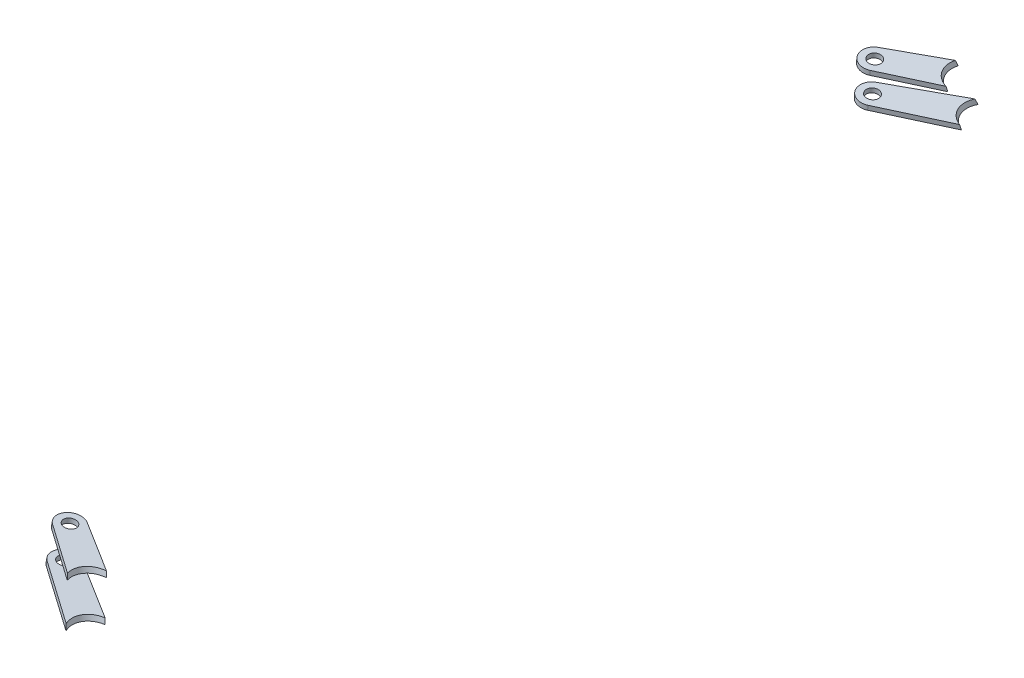
ISO-10303-21;
HEADER;
FILE_DESCRIPTION(('STEP AP214'),'2;1');
FILE_NAME('part.step','',(''),(''),'','','');
FILE_SCHEMA(('AUTOMOTIVE_DESIGN { 1 0 10303 214 1 1 1 1 }'));
ENDSEC;
DATA;
#1=APPLICATION_CONTEXT('core data for automotive mechanical design processes');
#2=APPLICATION_PROTOCOL_DEFINITION('international standard','automotive_design',2000,#1);
#3=PRODUCT_CONTEXT('',#1,'mechanical');
#4=PRODUCT('Part','Part','',(#3));
#5=PRODUCT_RELATED_PRODUCT_CATEGORY('part','',(#4));
#6=PRODUCT_DEFINITION_FORMATION('','',#4);
#7=PRODUCT_DEFINITION_CONTEXT('part definition',#1,'design');
#8=PRODUCT_DEFINITION('design','',#6,#7);
#9=PRODUCT_DEFINITION_SHAPE('','',#8);
#10=(LENGTH_UNIT() NAMED_UNIT(*) SI_UNIT(.MILLI.,.METRE.));
#11=(NAMED_UNIT(*) PLANE_ANGLE_UNIT() SI_UNIT($,.RADIAN.));
#12=(NAMED_UNIT(*) SI_UNIT($,.STERADIAN.) SOLID_ANGLE_UNIT());
#13=UNCERTAINTY_MEASURE_WITH_UNIT(LENGTH_MEASURE(1.E-05),#10,'distance_accuracy_value','');
#14=(GEOMETRIC_REPRESENTATION_CONTEXT(3) GLOBAL_UNCERTAINTY_ASSIGNED_CONTEXT((#13)) GLOBAL_UNIT_ASSIGNED_CONTEXT((#10,
#11,#12)) REPRESENTATION_CONTEXT('',''));
#15=CARTESIAN_POINT('',(0.,0.,0.));
#16=DIRECTION('',(0.,0.,1.));
#17=DIRECTION('',(1.,0.,0.));
#18=AXIS2_PLACEMENT_3D('',#15,#16,#17);
#19=CARTESIAN_POINT('',(-286.129302411596,180.27142449112,508.444930303704));
#20=DIRECTION('',(-0.501397384169984,0.100624420450439,0.859345907744088));
#21=DIRECTION('',(-0.846367762383379,0.149146955625286,-0.511289347068626));
#22=AXIS2_PLACEMENT_3D('',#19,#20,#21);
#23=PLANE('',#22);
#24=CARTESIAN_POINT('',(-639.298520510106,-11.032154332247,324.783951700712));
#25=DIRECTION('',(0.501397384169984,-0.100624420450439,-0.859345907744088));
#26=DIRECTION('',(-0.202674891665202,0.951920475194922,-0.229717864331821));
#27=AXIS2_PLACEMENT_3D('',#24,#25,#26);
#28=ELLIPSE('',#27,332.493914321312,12.7);
#29=CARTESIAN_POINT('',(-695.525150035273,215.977074424483,265.396274881335));
#30=VERTEX_POINT('',#29);
#31=CARTESIAN_POINT('',(-694.988595812932,212.923731464963,266.066863690908));
#32=VERTEX_POINT('',#31);
#33=EDGE_CURVE('E98',#30,#32,#28,.F.);
#34=ORIENTED_EDGE('',*,*,#33,.T.);
#35=DIRECTION('',(-0.85747457450148,0.0747850452358586,-0.509062423571586));
#36=VECTOR('',#35,1.);
#37=CARTESIAN_POINT('',(-286.475773413383,177.295094988669,508.591287871866));
#38=LINE('',#37,#36);
#39=CARTESIAN_POINT('',(-725.94940792128,215.623993143752,247.686160033562));
#40=VERTEX_POINT('',#39);
#41=EDGE_CURVE('E53',#32,#40,#38,.T.);
#42=ORIENTED_EDGE('',*,*,#41,.T.);
#43=DIRECTION('',(-0.115490333928878,-0.992109834150475,0.0487858560539045));
#44=VECTOR('',#43,1.);
#45=CARTESIAN_POINT('',(-725.602936919493,218.600322646203,247.539802465401));
#46=LINE('',#45,#44);
#47=CARTESIAN_POINT('',(-725.602936919493,218.600322646203,247.539802465401));
#48=VERTEX_POINT('',#47);
#49=EDGE_CURVE('E122',#48,#40,#46,.T.);
#50=ORIENTED_EDGE('',*,*,#49,.F.);
#51=DIRECTION('',(-0.85747457450148,0.0747850452358586,-0.509062423571586));
#52=VECTOR('',#51,1.);
#53=CARTESIAN_POINT('',(-286.129302411596,180.27142449112,508.444930303704));
#54=LINE('',#53,#52);
#55=EDGE_CURVE('E121',#30,#48,#54,.T.);
#56=ORIENTED_EDGE('',*,*,#55,.F.);
#57=EDGE_LOOP('',(#34,#42,#50,#56));
#58=FACE_BOUND('',#57,.T.);
#59=ADVANCED_FACE('F50',(#58),#23,.F.);
#60=CARTESIAN_POINT('',(-729.614115992853,219.405318009807,254.414569727353));
#61=DIRECTION('',(-0.115490333928878,-0.992109834150475,0.0487858560539045));
#62=DIRECTION('',(-0.993292586177464,0.115628016695291,0.));
#63=AXIS2_PLACEMENT_3D('',#60,#61,#62);
#64=CYLINDRICAL_SURFACE('',#63,7.99999999999999);
#65=CARTESIAN_POINT('',(-729.960586994639,216.428988507355,254.560927295515));
#66=DIRECTION('',(0.115490333928878,0.992109834150476,-0.0487858560539045));
#67=DIRECTION('',(0.993292586177464,-0.115628016695292,0.));
#68=AXIS2_PLACEMENT_3D('',#65,#66,#67);
#69=CIRCLE('',#68,7.99999999999999);
#70=CARTESIAN_POINT('',(-734.369252206518,217.267858948728,261.183613112626));
#71=VERTEX_POINT('',#70);
#72=EDGE_CURVE('E105',#40,#71,#69,.T.);
#73=ORIENTED_EDGE('',*,*,#72,.T.);
#74=DIRECTION('',(-0.115490333928878,-0.992109834150475,0.0487858560539045));
#75=VECTOR('',#74,1.);
#76=CARTESIAN_POINT('',(-734.022781204731,220.24418845118,261.037255544464));
#77=LINE('',#76,#75);
#78=CARTESIAN_POINT('',(-734.022781204731,220.24418845118,261.037255544464));
#79=VERTEX_POINT('',#78);
#80=EDGE_CURVE('E103',#79,#71,#77,.T.);
#81=ORIENTED_EDGE('',*,*,#80,.F.);
#82=CARTESIAN_POINT('',(-729.614115992853,219.405318009807,254.414569727353));
#83=DIRECTION('',(0.115490333928878,0.992109834150476,-0.0487858560539045));
#84=DIRECTION('',(0.993292586177464,-0.115628016695292,0.));
#85=AXIS2_PLACEMENT_3D('',#82,#83,#84);
#86=CIRCLE('',#85,7.99999999999999);
#87=EDGE_CURVE('E114',#48,#79,#86,.T.);
#88=ORIENTED_EDGE('',*,*,#87,.F.);
#89=ORIENTED_EDGE('',*,*,#49,.T.);
#90=EDGE_LOOP('',(#73,#81,#88,#89));
#91=FACE_BOUND('',#90,.T.);
#92=ADVANCED_FACE('F133',(#91),#64,.T.);
#93=CARTESIAN_POINT('',(-340.756964810652,187.541674565084,526.973243548694));
#94=DIRECTION('',(0.55108315148477,-0.104858805171619,-0.827835727138902));
#95=DIRECTION('',(0.81646334744491,-0.137115367811907,0.560880538251113));
#96=AXIS2_PLACEMENT_3D('',#93,#94,#95);
#97=PLANE('',#96);
#98=CARTESIAN_POINT('',(-727.593779343897,369.37508067401,246.427143695227));
#99=DIRECTION('',(-0.55108315148477,0.104858805171619,0.827835727138902));
#100=DIRECTION('',(-0.189249421914765,0.950516459117124,-0.246380026082417));
#101=AXIS2_PLACEMENT_3D('',#98,#99,#100);
#102=ELLIPSE('',#101,213.612425520889,12.7);
#103=CARTESIAN_POINT('',(-704.13175194097,214.753421560343,281.630952221903));
#104=VERTEX_POINT('',#103);
#105=CARTESIAN_POINT('',(-704.932216165397,217.825125904945,280.709008930689));
#106=VERTEX_POINT('',#105);
#107=EDGE_CURVE('E12',#104,#106,#102,.F.);
#108=ORIENTED_EDGE('',*,*,#107,.T.);
#109=DIRECTION('',(0.826419592530701,-0.0687219612634595,0.55884519244733));
#110=VECTOR('',#109,1.);
#111=CARTESIAN_POINT('',(-340.756964810652,187.541674565084,526.973243548694));
#112=LINE('',#111,#110);
#113=EDGE_CURVE('E111',#79,#106,#112,.T.);
#114=ORIENTED_EDGE('',*,*,#113,.F.);
#115=ORIENTED_EDGE('',*,*,#80,.T.);
#116=DIRECTION('',(0.826419592530701,-0.0687219612634595,0.55884519244733));
#117=VECTOR('',#116,1.);
#118=CARTESIAN_POINT('',(-341.103435812439,184.565345062633,527.119601116856));
#119=LINE('',#118,#117);
#120=EDGE_CURVE('E94',#71,#104,#119,.T.);
#121=ORIENTED_EDGE('',*,*,#120,.T.);
#122=EDGE_LOOP('',(#108,#114,#115,#121));
#123=FACE_BOUND('',#122,.T.);
#124=ADVANCED_FACE('F101',(#123),#97,.F.);
#125=CARTESIAN_POINT('',(-729.614115992853,219.405318009807,254.414569727353));
#126=DIRECTION('',(-0.115490333928878,-0.992109834150475,0.0487858560539045));
#127=DIRECTION('',(-0.993292586177464,0.115628016695291,0.));
#128=AXIS2_PLACEMENT_3D('',#125,#126,#127);
#129=CYLINDRICAL_SURFACE('',#128,4.00000000000005);
#130=CARTESIAN_POINT('',(-729.614115992853,219.405318009807,254.414569727353));
#131=DIRECTION('',(0.115490333928878,0.992109834150476,-0.0487858560539045));
#132=DIRECTION('',(0.993292586177464,-0.115628016695292,0.));
#133=AXIS2_PLACEMENT_3D('',#130,#131,#132);
#134=CIRCLE('',#133,4.00000000000005);
#135=CARTESIAN_POINT('',(-725.640945648143,218.942805943025,254.414569727353));
#136=VERTEX_POINT('',#135);
#137=EDGE_CURVE('E107',#136,#136,#134,.T.);
#138=ORIENTED_EDGE('',*,*,#137,.T.);
#139=EDGE_LOOP('',(#138));
#140=FACE_BOUND('',#139,.T.);
#141=CARTESIAN_POINT('',(-729.960586994639,216.428988507355,254.560927295515));
#142=DIRECTION('',(0.115490333928878,0.992109834150476,-0.0487858560539045));
#143=DIRECTION('',(0.993292586177464,-0.115628016695292,0.));
#144=AXIS2_PLACEMENT_3D('',#141,#142,#143);
#145=CIRCLE('',#144,4.00000000000005);
#146=CARTESIAN_POINT('',(-725.98741664993,215.966476440574,254.560927295515));
#147=VERTEX_POINT('',#146);
#148=EDGE_CURVE('E108',#147,#147,#145,.T.);
#149=ORIENTED_EDGE('',*,*,#148,.F.);
#150=EDGE_LOOP('',(#149));
#151=FACE_BOUND('',#150,.T.);
#152=ADVANCED_FACE('F141',(#140,#151),#129,.F.);
#153=CARTESIAN_POINT('',(13.9742106639152,120.044261303276,-5.90303800088192));
#154=DIRECTION('',(0.115490333928878,0.992109834150476,-0.0487858560539045));
#155=DIRECTION('',(0.993292586177464,-0.115628016695292,0.));
#156=AXIS2_PLACEMENT_3D('',#153,#154,#155);
#157=PLANE('',#156);
#158=ORIENTED_EDGE('',*,*,#55,.T.);
#159=ORIENTED_EDGE('',*,*,#87,.T.);
#160=ORIENTED_EDGE('',*,*,#113,.T.);
#161=CARTESIAN_POINT('',(-692.038418663605,216.189998884956,277.980418550402));
#162=DIRECTION('',(-0.115490333928878,-0.992109834150476,0.0487858560539045));
#163=DIRECTION('',(-0.90539408171368,0.0849400830971589,-0.415988868939171));
#164=AXIS2_PLACEMENT_3D('',#161,#162,#163);
#165=ELLIPSE('',#164,13.6334936945789,12.7);
#166=EDGE_CURVE('E68',#30,#106,#165,.F.);
#167=ORIENTED_EDGE('',*,*,#166,.F.);
#168=EDGE_LOOP('',(#158,#159,#160,#167));
#169=FACE_BOUND('',#168,.T.);
#170=ORIENTED_EDGE('',*,*,#137,.F.);
#171=EDGE_LOOP('',(#170));
#172=FACE_BOUND('',#171,.T.);
#173=ADVANCED_FACE('F112',(#169,#172),#157,.T.);
#174=CARTESIAN_POINT('',(13.6277396621286,117.067931800824,-5.75668043272021));
#175=DIRECTION('',(0.115490333928878,0.992109834150476,-0.0487858560539045));
#176=DIRECTION('',(0.993292586177464,-0.115628016695292,0.));
#177=AXIS2_PLACEMENT_3D('',#174,#175,#176);
#178=PLANE('',#177);
#179=CARTESIAN_POINT('',(-691.32450089441,213.11418838065,278.613978248979));
#180=DIRECTION('',(-0.115490333928878,-0.992109834150476,0.0487858560539045));
#181=DIRECTION('',(-0.90539408171368,0.0849400830971589,-0.415988868939171));
#182=AXIS2_PLACEMENT_3D('',#179,#180,#181);
#183=ELLIPSE('',#182,13.6334936945789,12.7);
#184=EDGE_CURVE('E59',#32,#104,#183,.F.);
#185=ORIENTED_EDGE('',*,*,#184,.T.);
#186=ORIENTED_EDGE('',*,*,#120,.F.);
#187=ORIENTED_EDGE('',*,*,#72,.F.);
#188=ORIENTED_EDGE('',*,*,#41,.F.);
#189=EDGE_LOOP('',(#185,#186,#187,#188));
#190=FACE_BOUND('',#189,.T.);
#191=ORIENTED_EDGE('',*,*,#148,.T.);
#192=EDGE_LOOP('',(#191));
#193=FACE_BOUND('',#192,.T.);
#194=ADVANCED_FACE('F92',(#190,#193),#178,.F.);
#195=CARTESIAN_POINT('',(-676.260714615963,148.214063927805,291.982195578494));
#196=DIRECTION('',(-0.221678460217085,0.955069289398282,-0.196726492176431));
#197=DIRECTION('',(-0.97410485020902,-0.226096750970159,0.));
#198=AXIS2_PLACEMENT_3D('',#195,#196,#197);
#199=CYLINDRICAL_SURFACE('',#198,12.7);
#200=ORIENTED_EDGE('',*,*,#33,.F.);
#201=ORIENTED_EDGE('',*,*,#166,.T.);
#202=ORIENTED_EDGE('',*,*,#107,.F.);
#203=ORIENTED_EDGE('',*,*,#184,.F.);
#204=EDGE_LOOP('',(#200,#201,#202,#203));
#205=FACE_BOUND('',#204,.T.);
#206=ADVANCED_FACE('F106',(#205),#199,.F.);
#207=CLOSED_SHELL('',(#59,#92,#124,#152,#173,#194,#206));
#208=MANIFOLD_SOLID_BREP('B2',#207);
#209=CARTESIAN_POINT('',(-732.385884007146,195.594681990195,255.585430272647));
#210=DIRECTION('',(0.115490333928878,0.992109834150475,-0.0487858560539045));
#211=DIRECTION('',(-0.993292586177463,0.115628016695291,0.));
#212=AXIS2_PLACEMENT_3D('',#209,#210,#211);
#213=CYLINDRICAL_SURFACE('',#212,4.00000000000005);
#214=CARTESIAN_POINT('',(-732.385884007146,195.594681990195,255.585430272647));
#215=DIRECTION('',(0.115490333928878,0.992109834150476,-0.0487858560539046));
#216=DIRECTION('',(0.993292586177463,-0.115628016695291,0.));
#217=AXIS2_PLACEMENT_3D('',#214,#215,#216);
#218=CIRCLE('',#217,4.00000000000005);
#219=CARTESIAN_POINT('',(-736.359054351856,196.057194056976,255.585430272647));
#220=VERTEX_POINT('',#219);
#221=EDGE_CURVE('E262',#220,#220,#218,.T.);
#222=CARTESIAN_POINT('',(-732.039413005359,198.571011492647,255.439072704485));
#223=DIRECTION('',(0.115490333928878,0.992109834150476,-0.0487858560539046));
#224=DIRECTION('',(0.993292586177463,-0.115628016695291,0.));
#225=AXIS2_PLACEMENT_3D('',#222,#223,#224);
#226=CIRCLE('',#225,4.00000000000005);
#227=CARTESIAN_POINT('',(-736.012583350069,199.033523559428,255.439072704485));
#228=VERTEX_POINT('',#227);
#229=EDGE_CURVE('E254',#228,#228,#226,.T.);
#230=CARTESIAN_POINT('',(-736.359054351856,196.057194056976,255.585430272647));
#231=CARTESIAN_POINT('',(-736.35544527892,196.088197489294,255.583905714645));
#232=CARTESIAN_POINT('',(-736.351836205985,196.119200921611,255.582381156643));
#233=CARTESIAN_POINT('',(-736.344618060114,196.181207786245,255.57933204064));
#234=CARTESIAN_POINT('',(-736.341008987179,196.212211218562,255.577807482638));
#235=CARTESIAN_POINT('',(-736.333790841309,196.274218083197,255.574758366635));
#236=CARTESIAN_POINT('',(-736.330181768373,196.305221515514,255.573233808633));
#237=CARTESIAN_POINT('',(-736.322963622503,196.367228380148,255.57018469263));
#238=CARTESIAN_POINT('',(-736.319354549568,196.398231812466,255.568660134628));
#239=CARTESIAN_POINT('',(-736.312136403697,196.4602386771,255.565611018625));
#240=CARTESIAN_POINT('',(-736.308527330762,196.491242109417,255.564086460623));
#241=CARTESIAN_POINT('',(-736.301309184891,196.553248974052,255.56103734462));
#242=CARTESIAN_POINT('',(-736.297700111956,196.584252406369,255.559512786618));
#243=CARTESIAN_POINT('',(-736.290481966085,196.646259271003,255.556463670615));
#244=CARTESIAN_POINT('',(-736.28687289315,196.67726270332,255.554939112613));
#245=CARTESIAN_POINT('',(-736.27965474728,196.739269567955,255.55188999661));
#246=CARTESIAN_POINT('',(-736.276045674344,196.770273000272,255.550365438608));
#247=CARTESIAN_POINT('',(-736.268827528474,196.832279864906,255.547316322605));
#248=CARTESIAN_POINT('',(-736.265218455539,196.863283297224,255.545791764603));
#249=CARTESIAN_POINT('',(-736.258000309668,196.925290161858,255.5427426486));
#250=CARTESIAN_POINT('',(-736.254391236733,196.956293594175,255.541218090598));
#251=CARTESIAN_POINT('',(-736.247173090862,197.01830045881,255.538168974595));
#252=CARTESIAN_POINT('',(-736.243564017927,197.049303891127,255.536644416593));
#253=CARTESIAN_POINT('',(-736.236345872056,197.111310755761,255.53359530059));
#254=CARTESIAN_POINT('',(-736.232736799121,197.142314188078,255.532070742588));
#255=CARTESIAN_POINT('',(-736.22551865325,197.204321052713,255.529021626585));
#256=CARTESIAN_POINT('',(-736.221909580315,197.23532448503,255.527497068583));
#257=CARTESIAN_POINT('',(-736.214691434444,197.297331349665,255.524447952579));
#258=CARTESIAN_POINT('',(-736.211082361509,197.328334781982,255.522923394578));
#259=CARTESIAN_POINT('',(-736.203864215639,197.390341646616,255.519874278574));
#260=CARTESIAN_POINT('',(-736.200255142703,197.421345078933,255.518349720573));
#261=CARTESIAN_POINT('',(-736.193036996833,197.483351943568,255.515300604569));
#262=CARTESIAN_POINT('',(-736.189427923898,197.514355375885,255.513776046568));
#263=CARTESIAN_POINT('',(-736.182209778027,197.576362240519,255.510726930564));
#264=CARTESIAN_POINT('',(-736.178600705092,197.607365672837,255.509202372563));
#265=CARTESIAN_POINT('',(-736.171382559221,197.669372537471,255.506153256559));
#266=CARTESIAN_POINT('',(-736.167773486286,197.700375969788,255.504628698558));
#267=CARTESIAN_POINT('',(-736.160555340415,197.762382834423,255.501579582554));
#268=CARTESIAN_POINT('',(-736.15694626748,197.79338626674,255.500055024553));
#269=CARTESIAN_POINT('',(-736.14972812161,197.855393131374,255.497005908549));
#270=CARTESIAN_POINT('',(-736.146119048674,197.886396563691,255.495481350547));
#271=CARTESIAN_POINT('',(-736.138900902804,197.948403428326,255.492432234544));
#272=CARTESIAN_POINT('',(-736.135291829868,197.979406860643,255.490907676542));
#273=CARTESIAN_POINT('',(-736.128073683998,198.041413725277,255.487858560539));
#274=CARTESIAN_POINT('',(-736.124464611063,198.072417157595,255.486334002537));
#275=CARTESIAN_POINT('',(-736.117246465192,198.134424022229,255.483284886534));
#276=CARTESIAN_POINT('',(-736.113637392257,198.165427454546,255.481760328532));
#277=CARTESIAN_POINT('',(-736.106419246386,198.227434319181,255.478711212529));
#278=CARTESIAN_POINT('',(-736.102810173451,198.258437751498,255.477186654527));
#279=CARTESIAN_POINT('',(-736.09559202758,198.320444616132,255.474137538524));
#280=CARTESIAN_POINT('',(-736.091982954645,198.351448048449,255.472612980522));
#281=CARTESIAN_POINT('',(-736.084764808775,198.413454913084,255.469563864519));
#282=CARTESIAN_POINT('',(-736.081155735839,198.444458345401,255.468039306517));
#283=CARTESIAN_POINT('',(-736.073937589969,198.506465210035,255.464990190514));
#284=CARTESIAN_POINT('',(-736.070328517033,198.537468642353,255.463465632512));
#285=CARTESIAN_POINT('',(-736.063110371163,198.599475506987,255.460416516509));
#286=CARTESIAN_POINT('',(-736.059501298228,198.630478939304,255.458891958507));
#287=CARTESIAN_POINT('',(-736.052283152357,198.692485803939,255.455842842504));
#288=CARTESIAN_POINT('',(-736.048674079422,198.723489236256,255.454318284502));
#289=CARTESIAN_POINT('',(-736.041455933551,198.78549610089,255.451269168499));
#290=CARTESIAN_POINT('',(-736.037846860616,198.816499533207,255.449744610497));
#291=CARTESIAN_POINT('',(-736.030628714745,198.878506397842,255.446695494494));
#292=CARTESIAN_POINT('',(-736.02701964181,198.909509830159,255.445170936492));
#293=CARTESIAN_POINT('',(-736.01980149594,198.971516694793,255.442121820489));
#294=CARTESIAN_POINT('',(-736.016192423004,199.002520127111,255.440597262487));
#295=CARTESIAN_POINT('',(-736.012583350069,199.033523559428,255.439072704485));
#296=B_SPLINE_CURVE_WITH_KNOTS('',3,(#230,#231,#232,#233,#234,#235,#236,#237,#238,#239,#240,
#241,#242,#243,#244,#245,#246,#247,#248,#249,#250,#251,#252,#253,#254,#255,#256,#257,#258,#259,
#260,#261,#262,#263,#264,#265,#266,#267,#268,#269,#270,#271,#272,#273,#274,#275,#276,#277,#278,
#279,#280,#281,#282,#283,#284,#285,#286,#287,#288,#289,#290,#291,#292,#293,#294,#295),
.UNSPECIFIED.,.F.,.F.,(4,2,2,2,2,2,2,2,2,2,2,2,2,2,2,2,2,2,2,2,2,2,2,2,2,2,2,2,2,2,2,2,4),(0.,
0.0937500000000034,0.187500000000032,0.281249999999992,0.375000000000023,0.468750000000024,
0.562500000000027,0.65625,0.750000000000018,0.843750000000019,0.937500000000023,
1.03125000000002,1.12500000000003,1.21875000000003,1.31250000000002,1.40625000000002,
1.50000000000002,1.59375000000002,1.68750000000003,1.78125000000001,1.87500000000002,
1.96874999999999,2.06250000000002,2.15625000000002,2.25000000000001,2.34374999999999,
2.43750000000002,2.53124999999999,2.62500000000002,2.71874999999999,2.81250000000001,
2.90624999999999,3.00000000000002),.UNSPECIFIED.);
#297=EDGE_CURVE('BSEAM213',#220,#228,#296,.T.);
#298=ORIENTED_EDGE('',*,*,#221,.F.);
#299=ORIENTED_EDGE('',*,*,#229,.T.);
#300=ORIENTED_EDGE('',*,*,#297,.T.);
#301=ORIENTED_EDGE('',*,*,#297,.F.);
#302=EDGE_LOOP('',(#298,#300,#299,#301));
#303=FACE_BOUND('',#302,.T.);
#304=ADVANCED_FACE('F213',(#303),#213,.F.);
#305=CARTESIAN_POINT('',(-732.385884007146,195.594681990195,255.585430272647));
#306=DIRECTION('',(0.115490333928878,0.992109834150475,-0.0487858560539045));
#307=DIRECTION('',(-0.993292586177463,0.115628016695291,0.));
#308=AXIS2_PLACEMENT_3D('',#305,#306,#307);
#309=CYLINDRICAL_SURFACE('',#308,7.99999999999999);
#310=CARTESIAN_POINT('',(-732.039413005359,198.571011492647,255.439072704485));
#311=DIRECTION('',(0.115490333928878,0.992109834150476,-0.0487858560539046));
#312=DIRECTION('',(0.993292586177463,-0.115628016695291,0.));
#313=AXIS2_PLACEMENT_3D('',#310,#311,#312);
#314=CIRCLE('',#313,7.99999999999999);
#315=CARTESIAN_POINT('',(-728.028233931999,197.766016129043,248.564305442533));
#316=VERTEX_POINT('',#315);
#317=CARTESIAN_POINT('',(-736.448078217237,199.40988193402,262.061758521596));
#318=VERTEX_POINT('',#317);
#319=EDGE_CURVE('E255',#316,#318,#314,.T.);
#320=ORIENTED_EDGE('',*,*,#319,.F.);
#321=DIRECTION('',(0.115490333928878,0.992109834150475,-0.0487858560539045));
#322=VECTOR('',#321,1.);
#323=CARTESIAN_POINT('',(-728.374704933786,194.789686626592,248.710663010694));
#324=LINE('',#323,#322);
#325=CARTESIAN_POINT('',(-728.374704933786,194.789686626592,248.710663010694));
#326=VERTEX_POINT('',#325);
#327=EDGE_CURVE('E221',#326,#316,#324,.T.);
#328=ORIENTED_EDGE('',*,*,#327,.F.);
#329=CARTESIAN_POINT('',(-732.385884007146,195.594681990195,255.585430272647));
#330=DIRECTION('',(0.115490333928878,0.992109834150476,-0.0487858560539046));
#331=DIRECTION('',(0.993292586177463,-0.115628016695291,0.));
#332=AXIS2_PLACEMENT_3D('',#329,#330,#331);
#333=CIRCLE('',#332,7.99999999999999);
#334=CARTESIAN_POINT('',(-736.794549219024,196.433552431568,262.208116089758));
#335=VERTEX_POINT('',#334);
#336=EDGE_CURVE('E261',#326,#335,#333,.T.);
#337=ORIENTED_EDGE('',*,*,#336,.T.);
#338=DIRECTION('',(0.115490333928878,0.992109834150475,-0.0487858560539045));
#339=VECTOR('',#338,1.);
#340=CARTESIAN_POINT('',(-736.794549219024,196.433552431568,262.208116089758));
#341=LINE('',#340,#339);
#342=EDGE_CURVE('E249',#335,#318,#341,.T.);
#343=ORIENTED_EDGE('',*,*,#342,.T.);
#344=EDGE_LOOP('',(#320,#328,#337,#343));
#345=FACE_BOUND('',#344,.T.);
#346=ADVANCED_FACE('F259',(#345),#309,.T.);
#347=CARTESIAN_POINT('',(11.5489136514089,99.2099547861161,-4.87853502374995));
#348=DIRECTION('',(-0.115490333928878,-0.992109834150476,0.0487858560539046));
#349=DIRECTION('',(0.993292586177463,-0.115628016695291,0.));
#350=AXIS2_PLACEMENT_3D('',#347,#348,#349);
#351=PLANE('',#350);
#352=CARTESIAN_POINT('',(-687.040994279238,194.659325354811,282.415336440443));
#353=DIRECTION('',(0.115490333928878,0.992109834150476,-0.0487858560539046));
#354=DIRECTION('',(-0.90539408171368,0.0849400830971584,-0.415988868939171));
#355=AXIS2_PLACEMENT_3D('',#352,#353,#354);
#356=ELLIPSE('',#355,13.6334936945789,12.7);
#357=CARTESIAN_POINT('',(-699.092698006537,196.303548280965,287.322382581663));
#358=VERTEX_POINT('',#357);
#359=CARTESIAN_POINT('',(-691.708685251136,194.598389738927,270.126364568607));
#360=VERTEX_POINT('',#359);
#361=EDGE_CURVE('E48',#358,#360,#356,.F.);
#362=ORIENTED_EDGE('',*,*,#361,.T.);
#363=DIRECTION('',(-0.85747457450148,0.0747850452358581,-0.509062423571586));
#364=VECTOR('',#363,1.);
#365=CARTESIAN_POINT('',(-288.554599424102,159.437117973961,509.469433280836));
#366=LINE('',#365,#364);
#367=EDGE_CURVE('E267',#360,#316,#366,.T.);
#368=ORIENTED_EDGE('',*,*,#367,.T.);
#369=ORIENTED_EDGE('',*,*,#319,.T.);
#370=DIRECTION('',(0.826419592530701,-0.0687219612634589,0.55884519244733));
#371=VECTOR('',#370,1.);
#372=CARTESIAN_POINT('',(-343.182261823159,166.707368047924,527.997746525826));
#373=LINE('',#372,#371);
#374=EDGE_CURVE('E246',#318,#358,#373,.T.);
#375=ORIENTED_EDGE('',*,*,#374,.T.);
#376=EDGE_LOOP('',(#362,#368,#369,#375));
#377=FACE_BOUND('',#376,.T.);
#378=ORIENTED_EDGE('',*,*,#229,.F.);
#379=EDGE_LOOP('',(#378));
#380=FACE_BOUND('',#379,.T.);
#381=ADVANCED_FACE('F264',(#377,#380),#351,.F.);
#382=CARTESIAN_POINT('',(11.2024426496222,96.2336252836647,-4.73217745558823));
#383=DIRECTION('',(-0.115490333928878,-0.992109834150476,0.0487858560539046));
#384=DIRECTION('',(0.993292586177463,-0.115628016695291,0.));
#385=AXIS2_PLACEMENT_3D('',#382,#383,#384);
#386=PLANE('',#385);
#387=DIRECTION('',(0.826419592530701,-0.0687219612634589,0.55884519244733));
#388=VECTOR('',#387,1.);
#389=CARTESIAN_POINT('',(-343.528732824945,163.731038545473,528.144104093988));
#390=LINE('',#389,#388);
#391=CARTESIAN_POINT('',(-698.200136810533,193.224185496788,288.306604103295));
#392=VERTEX_POINT('',#391);
#393=EDGE_CURVE('E236',#335,#392,#390,.T.);
#394=ORIENTED_EDGE('',*,*,#393,.F.);
#395=ORIENTED_EDGE('',*,*,#336,.F.);
#396=DIRECTION('',(-0.85747457450148,0.0747850452358581,-0.509062423571586));
#397=VECTOR('',#396,1.);
#398=CARTESIAN_POINT('',(-288.901070425889,156.460788471509,509.615790848998));
#399=LINE('',#398,#397);
#400=CARTESIAN_POINT('',(-691.152868761745,191.543366811796,270.808388931652));
#401=VERTEX_POINT('',#400);
#402=EDGE_CURVE('E275',#401,#326,#399,.T.);
#403=ORIENTED_EDGE('',*,*,#402,.F.);
#404=CARTESIAN_POINT('',(-686.327076510043,191.583514850505,283.04889613902));
#405=DIRECTION('',(0.115490333928878,0.992109834150476,-0.0487858560539046));
#406=DIRECTION('',(-0.90539408171368,0.0849400830971584,-0.415988868939171));
#407=AXIS2_PLACEMENT_3D('',#404,#405,#406);
#408=ELLIPSE('',#407,13.6334936945789,12.7);
#409=EDGE_CURVE('E270',#392,#401,#408,.F.);
#410=ORIENTED_EDGE('',*,*,#409,.F.);
#411=EDGE_LOOP('',(#394,#395,#403,#410));
#412=FACE_BOUND('',#411,.T.);
#413=ORIENTED_EDGE('',*,*,#221,.T.);
#414=EDGE_LOOP('',(#413));
#415=FACE_BOUND('',#414,.T.);
#416=ADVANCED_FACE('F284',(#412,#415),#386,.T.);
#417=CARTESIAN_POINT('',(-343.528732824945,163.731038545473,528.144104093988));
#418=DIRECTION('',(0.55108315148477,-0.104858805171619,-0.827835727138902));
#419=DIRECTION('',(0.832424785453371,0.,0.554138048290233));
#420=AXIS2_PLACEMENT_3D('',#417,#418,#419);
#421=PLANE('',#420);
#422=CARTESIAN_POINT('',(-727.593779343897,369.375080674011,246.427143695227));
#423=DIRECTION('',(-0.55108315148477,0.104858805171619,0.827835727138902));
#424=DIRECTION('',(-0.189249421914765,0.950516459117124,-0.246380026082417));
#425=AXIS2_PLACEMENT_3D('',#422,#423,#424);
#426=ELLIPSE('',#425,213.612425520889,12.7);
#427=EDGE_CURVE('E228',#392,#358,#426,.F.);
#428=ORIENTED_EDGE('',*,*,#427,.T.);
#429=ORIENTED_EDGE('',*,*,#374,.F.);
#430=ORIENTED_EDGE('',*,*,#342,.F.);
#431=ORIENTED_EDGE('',*,*,#393,.T.);
#432=EDGE_LOOP('',(#428,#429,#430,#431));
#433=FACE_BOUND('',#432,.T.);
#434=ADVANCED_FACE('F248',(#433),#421,.F.);
#435=CARTESIAN_POINT('',(-288.901070425889,156.460788471509,509.615790848998));
#436=DIRECTION('',(-0.501397384169984,0.100624420450439,0.859345907744088));
#437=DIRECTION('',(-0.863729783317673,0.,-0.503955217663242));
#438=AXIS2_PLACEMENT_3D('',#435,#436,#437);
#439=PLANE('',#438);
#440=CARTESIAN_POINT('',(-639.298520510106,-11.0321543322471,324.783951700712));
#441=DIRECTION('',(0.501397384169984,-0.100624420450439,-0.859345907744088));
#442=DIRECTION('',(-0.202674891665202,0.951920475194922,-0.229717864331821));
#443=AXIS2_PLACEMENT_3D('',#440,#441,#442);
#444=ELLIPSE('',#443,332.493914321312,12.7);
#445=EDGE_CURVE('E281',#360,#401,#444,.F.);
#446=ORIENTED_EDGE('',*,*,#445,.T.);
#447=ORIENTED_EDGE('',*,*,#402,.T.);
#448=ORIENTED_EDGE('',*,*,#327,.T.);
#449=ORIENTED_EDGE('',*,*,#367,.F.);
#450=EDGE_LOOP('',(#446,#447,#448,#449));
#451=FACE_BOUND('',#450,.T.);
#452=ADVANCED_FACE('F215',(#451),#439,.F.);
#453=CARTESIAN_POINT('',(-676.260714615963,148.214063927805,291.982195578494));
#454=DIRECTION('',(-0.221678460217085,0.955069289398282,-0.196726492176431));
#455=DIRECTION('',(-0.97410485020902,-0.226096750970159,0.));
#456=AXIS2_PLACEMENT_3D('',#453,#454,#455);
#457=CYLINDRICAL_SURFACE('',#456,12.7);
#458=ORIENTED_EDGE('',*,*,#427,.F.);
#459=ORIENTED_EDGE('',*,*,#409,.T.);
#460=ORIENTED_EDGE('',*,*,#445,.F.);
#461=ORIENTED_EDGE('',*,*,#361,.F.);
#462=EDGE_LOOP('',(#458,#459,#460,#461));
#463=FACE_BOUND('',#462,.T.);
#464=ADVANCED_FACE('F309',(#463),#457,.F.);
#465=CLOSED_SHELL('',(#304,#346,#381,#416,#434,#452,#464));
#466=MANIFOLD_SOLID_BREP('B6',#465);
#467=CARTESIAN_POINT('',(-286.129302411596,180.27142449112,-508.444930303704));
#468=DIRECTION('',(-0.501397384169984,0.100624420450439,-0.859345907744088));
#469=DIRECTION('',(-0.846367762383379,0.149146955625286,0.511289347068626));
#470=AXIS2_PLACEMENT_3D('',#467,#468,#469);
#471=PLANE('',#470);
#472=CARTESIAN_POINT('',(-639.298520510106,-11.032154332247,-324.783951700712));
#473=DIRECTION('',(-0.501397384169984,0.100624420450439,-0.859345907744088));
#474=DIRECTION('',(-0.202674891665202,0.951920475194922,0.229717864331821));
#475=AXIS2_PLACEMENT_3D('',#472,#473,#474);
#476=ELLIPSE('',#475,332.493914321312,12.7);
#477=CARTESIAN_POINT('',(-695.525150035273,215.977074424483,-265.396274881335));
#478=VERTEX_POINT('',#477);
#479=CARTESIAN_POINT('',(-694.988595812932,212.923731464963,-266.066863690908));
#480=VERTEX_POINT('',#479);
#481=EDGE_CURVE('E409',#478,#480,#476,.F.);
#482=ORIENTED_EDGE('',*,*,#481,.F.);
#483=DIRECTION('',(-0.85747457450148,0.0747850452358586,0.509062423571586));
#484=VECTOR('',#483,1.);
#485=CARTESIAN_POINT('',(-286.129302411596,180.27142449112,-508.444930303704));
#486=LINE('',#485,#484);
#487=CARTESIAN_POINT('',(-725.602936919493,218.600322646203,-247.539802465401));
#488=VERTEX_POINT('',#487);
#489=EDGE_CURVE('E432',#478,#488,#486,.T.);
#490=ORIENTED_EDGE('',*,*,#489,.T.);
#491=DIRECTION('',(-0.115490333928878,-0.992109834150475,-0.0487858560539045));
#492=VECTOR('',#491,1.);
#493=CARTESIAN_POINT('',(-725.602936919493,218.600322646203,-247.539802465401));
#494=LINE('',#493,#492);
#495=CARTESIAN_POINT('',(-725.94940792128,215.623993143752,-247.686160033562));
#496=VERTEX_POINT('',#495);
#497=EDGE_CURVE('E434',#488,#496,#494,.T.);
#498=ORIENTED_EDGE('',*,*,#497,.T.);
#499=DIRECTION('',(-0.85747457450148,0.0747850452358586,0.509062423571586));
#500=VECTOR('',#499,1.);
#501=CARTESIAN_POINT('',(-286.475773413383,177.295094988669,-508.591287871866));
#502=LINE('',#501,#500);
#503=EDGE_CURVE('E378',#480,#496,#502,.T.);
#504=ORIENTED_EDGE('',*,*,#503,.F.);
#505=EDGE_LOOP('',(#482,#490,#498,#504));
#506=FACE_BOUND('',#505,.T.);
#507=ADVANCED_FACE('F375',(#506),#471,.F.);
#508=CARTESIAN_POINT('',(-729.614115992853,219.405318009807,-254.414569727353));
#509=DIRECTION('',(-0.115490333928878,-0.992109834150475,-0.0487858560539045));
#510=DIRECTION('',(-0.993292586177464,0.115628016695291,0.));
#511=AXIS2_PLACEMENT_3D('',#508,#509,#510);
#512=CYLINDRICAL_SURFACE('',#511,7.99999999999999);
#513=CARTESIAN_POINT('',(-729.960586994639,216.428988507355,-254.560927295515));
#514=DIRECTION('',(-0.115490333928878,-0.992109834150476,-0.0487858560539045));
#515=DIRECTION('',(0.993292586177464,-0.115628016695292,0.));
#516=AXIS2_PLACEMENT_3D('',#513,#514,#515);
#517=CIRCLE('',#516,7.99999999999999);
#518=CARTESIAN_POINT('',(-734.369252206518,217.267858948728,-261.183613112626));
#519=VERTEX_POINT('',#518);
#520=EDGE_CURVE('E428',#496,#519,#517,.T.);
#521=ORIENTED_EDGE('',*,*,#520,.F.);
#522=ORIENTED_EDGE('',*,*,#497,.F.);
#523=CARTESIAN_POINT('',(-729.614115992853,219.405318009807,-254.414569727353));
#524=DIRECTION('',(-0.115490333928878,-0.992109834150476,-0.0487858560539045));
#525=DIRECTION('',(0.993292586177464,-0.115628016695292,0.));
#526=AXIS2_PLACEMENT_3D('',#523,#524,#525);
#527=CIRCLE('',#526,7.99999999999999);
#528=CARTESIAN_POINT('',(-734.022781204731,220.24418845118,-261.037255544464));
#529=VERTEX_POINT('',#528);
#530=EDGE_CURVE('E440',#488,#529,#527,.T.);
#531=ORIENTED_EDGE('',*,*,#530,.T.);
#532=DIRECTION('',(-0.115490333928878,-0.992109834150475,-0.0487858560539045));
#533=VECTOR('',#532,1.);
#534=CARTESIAN_POINT('',(-734.022781204731,220.24418845118,-261.037255544464));
#535=LINE('',#534,#533);
#536=EDGE_CURVE('E436',#529,#519,#535,.T.);
#537=ORIENTED_EDGE('',*,*,#536,.T.);
#538=EDGE_LOOP('',(#521,#522,#531,#537));
#539=FACE_BOUND('',#538,.T.);
#540=ADVANCED_FACE('F454',(#539),#512,.T.);
#541=CARTESIAN_POINT('',(-340.756964810652,187.541674565084,-526.973243548694));
#542=DIRECTION('',(0.55108315148477,-0.104858805171619,0.827835727138902));
#543=DIRECTION('',(0.81646334744491,-0.137115367811907,-0.560880538251113));
#544=AXIS2_PLACEMENT_3D('',#541,#542,#543);
#545=PLANE('',#544);
#546=CARTESIAN_POINT('',(-727.593779343897,369.37508067401,-246.427143695227));
#547=DIRECTION('',(0.55108315148477,-0.104858805171619,0.827835727138902));
#548=DIRECTION('',(-0.189249421914765,0.950516459117124,0.246380026082417));
#549=AXIS2_PLACEMENT_3D('',#546,#547,#548);
#550=ELLIPSE('',#549,213.612425520889,12.7);
#551=CARTESIAN_POINT('',(-704.13175194097,214.753421560343,-281.630952221903));
#552=VERTEX_POINT('',#551);
#553=CARTESIAN_POINT('',(-704.932216165397,217.825125904945,-280.709008930689));
#554=VERTEX_POINT('',#553);
#555=EDGE_CURVE('E211',#552,#554,#550,.F.);
#556=ORIENTED_EDGE('',*,*,#555,.F.);
#557=DIRECTION('',(0.826419592530701,-0.0687219612634595,-0.55884519244733));
#558=VECTOR('',#557,1.);
#559=CARTESIAN_POINT('',(-341.103435812439,184.565345062633,-527.119601116856));
#560=LINE('',#559,#558);
#561=EDGE_CURVE('E421',#519,#552,#560,.T.);
#562=ORIENTED_EDGE('',*,*,#561,.F.);
#563=ORIENTED_EDGE('',*,*,#536,.F.);
#564=DIRECTION('',(0.826419592530701,-0.0687219612634595,-0.55884519244733));
#565=VECTOR('',#564,1.);
#566=CARTESIAN_POINT('',(-340.756964810652,187.541674565084,-526.973243548694));
#567=LINE('',#566,#565);
#568=EDGE_CURVE('E423',#529,#554,#567,.T.);
#569=ORIENTED_EDGE('',*,*,#568,.T.);
#570=EDGE_LOOP('',(#556,#562,#563,#569));
#571=FACE_BOUND('',#570,.T.);
#572=ADVANCED_FACE('F419',(#571),#545,.F.);
#573=CARTESIAN_POINT('',(-729.614115992853,219.405318009807,-254.414569727353));
#574=DIRECTION('',(-0.115490333928878,-0.992109834150475,-0.0487858560539045));
#575=DIRECTION('',(-0.993292586177464,0.115628016695291,0.));
#576=AXIS2_PLACEMENT_3D('',#573,#574,#575);
#577=CYLINDRICAL_SURFACE('',#576,4.00000000000005);
#578=CARTESIAN_POINT('',(-729.614115992853,219.405318009807,-254.414569727353));
#579=DIRECTION('',(-0.115490333928878,-0.992109834150476,-0.0487858560539045));
#580=DIRECTION('',(0.993292586177464,-0.115628016695292,0.));
#581=AXIS2_PLACEMENT_3D('',#578,#579,#580);
#582=CIRCLE('',#581,4.00000000000005);
#583=CARTESIAN_POINT('',(-725.640945648143,218.942805943025,-254.414569727353));
#584=VERTEX_POINT('',#583);
#585=EDGE_CURVE('E439',#584,#584,#582,.T.);
#586=ORIENTED_EDGE('',*,*,#585,.F.);
#587=EDGE_LOOP('',(#586));
#588=FACE_BOUND('',#587,.T.);
#589=CARTESIAN_POINT('',(-729.960586994639,216.428988507355,-254.560927295515));
#590=DIRECTION('',(-0.115490333928878,-0.992109834150476,-0.0487858560539045));
#591=DIRECTION('',(0.993292586177464,-0.115628016695292,0.));
#592=AXIS2_PLACEMENT_3D('',#589,#590,#591);
#593=CIRCLE('',#592,4.00000000000005);
#594=CARTESIAN_POINT('',(-725.98741664993,215.966476440574,-254.560927295515));
#595=VERTEX_POINT('',#594);
#596=EDGE_CURVE('E435',#595,#595,#593,.T.);
#597=ORIENTED_EDGE('',*,*,#596,.T.);
#598=EDGE_LOOP('',(#597));
#599=FACE_BOUND('',#598,.T.);
#600=ADVANCED_FACE('F459',(#588,#599),#577,.F.);
#601=CARTESIAN_POINT('',(13.9742106639152,120.044261303276,5.90303800088192));
#602=DIRECTION('',(0.115490333928878,0.992109834150476,0.0487858560539045));
#603=DIRECTION('',(0.993292586177464,-0.115628016695292,0.));
#604=AXIS2_PLACEMENT_3D('',#601,#602,#603);
#605=PLANE('',#604);
#606=ORIENTED_EDGE('',*,*,#489,.F.);
#607=CARTESIAN_POINT('',(-692.038418663605,216.189998884956,-277.980418550402));
#608=DIRECTION('',(0.115490333928878,0.992109834150476,0.0487858560539045));
#609=DIRECTION('',(-0.90539408171368,0.0849400830971589,0.415988868939171));
#610=AXIS2_PLACEMENT_3D('',#607,#608,#609);
#611=ELLIPSE('',#610,13.6334936945789,12.7);
#612=EDGE_CURVE('E392',#478,#554,#611,.F.);
#613=ORIENTED_EDGE('',*,*,#612,.T.);
#614=ORIENTED_EDGE('',*,*,#568,.F.);
#615=ORIENTED_EDGE('',*,*,#530,.F.);
#616=EDGE_LOOP('',(#606,#613,#614,#615));
#617=FACE_BOUND('',#616,.T.);
#618=ORIENTED_EDGE('',*,*,#585,.T.);
#619=EDGE_LOOP('',(#618));
#620=FACE_BOUND('',#619,.T.);
#621=ADVANCED_FACE('F456',(#617,#620),#605,.T.);
#622=CARTESIAN_POINT('',(13.6277396621286,117.067931800824,5.75668043272021));
#623=DIRECTION('',(0.115490333928878,0.992109834150476,0.0487858560539045));
#624=DIRECTION('',(0.993292586177464,-0.115628016695292,0.));
#625=AXIS2_PLACEMENT_3D('',#622,#623,#624);
#626=PLANE('',#625);
#627=CARTESIAN_POINT('',(-691.32450089441,213.11418838065,-278.613978248979));
#628=DIRECTION('',(0.115490333928878,0.992109834150476,0.0487858560539045));
#629=DIRECTION('',(-0.90539408171368,0.0849400830971589,0.415988868939171));
#630=AXIS2_PLACEMENT_3D('',#627,#628,#629);
#631=ELLIPSE('',#630,13.6334936945789,12.7);
#632=EDGE_CURVE('E384',#480,#552,#631,.F.);
#633=ORIENTED_EDGE('',*,*,#632,.F.);
#634=ORIENTED_EDGE('',*,*,#503,.T.);
#635=ORIENTED_EDGE('',*,*,#520,.T.);
#636=ORIENTED_EDGE('',*,*,#561,.T.);
#637=EDGE_LOOP('',(#633,#634,#635,#636));
#638=FACE_BOUND('',#637,.T.);
#639=ORIENTED_EDGE('',*,*,#596,.F.);
#640=EDGE_LOOP('',(#639));
#641=FACE_BOUND('',#640,.T.);
#642=ADVANCED_FACE('F425',(#638,#641),#626,.F.);
#643=CARTESIAN_POINT('',(-676.260714615963,148.214063927805,-291.982195578494));
#644=DIRECTION('',(-0.221678460217085,0.955069289398282,0.196726492176431));
#645=DIRECTION('',(-0.97410485020902,-0.226096750970159,0.));
#646=AXIS2_PLACEMENT_3D('',#643,#644,#645);
#647=CYLINDRICAL_SURFACE('',#646,12.7);
#648=ORIENTED_EDGE('',*,*,#481,.T.);
#649=ORIENTED_EDGE('',*,*,#632,.T.);
#650=ORIENTED_EDGE('',*,*,#555,.T.);
#651=ORIENTED_EDGE('',*,*,#612,.F.);
#652=EDGE_LOOP('',(#648,#649,#650,#651));
#653=FACE_BOUND('',#652,.T.);
#654=ADVANCED_FACE('F412',(#653),#647,.F.);
#655=CLOSED_SHELL('',(#507,#540,#572,#600,#621,#642,#654));
#656=MANIFOLD_SOLID_BREP('B42',#655);
#657=CARTESIAN_POINT('',(-732.385884007146,195.594681990195,-255.585430272647));
#658=DIRECTION('',(0.115490333928878,0.992109834150475,0.0487858560539045));
#659=DIRECTION('',(-0.993292586177463,0.115628016695291,0.));
#660=AXIS2_PLACEMENT_3D('',#657,#658,#659);
#661=CYLINDRICAL_SURFACE('',#660,4.00000000000005);
#662=CARTESIAN_POINT('',(-732.385884007146,195.594681990195,-255.585430272647));
#663=DIRECTION('',(-0.115490333928878,-0.992109834150476,-0.0487858560539046));
#664=DIRECTION('',(0.993292586177463,-0.115628016695291,0.));
#665=AXIS2_PLACEMENT_3D('',#662,#663,#664);
#666=CIRCLE('',#665,4.00000000000005);
#667=CARTESIAN_POINT('',(-736.359054351856,196.057194056976,-255.585430272647));
#668=VERTEX_POINT('',#667);
#669=EDGE_CURVE('E580',#668,#668,#666,.T.);
#670=CARTESIAN_POINT('',(-732.039413005359,198.571011492647,-255.439072704485));
#671=DIRECTION('',(-0.115490333928878,-0.992109834150476,-0.0487858560539046));
#672=DIRECTION('',(0.993292586177463,-0.115628016695291,0.));
#673=AXIS2_PLACEMENT_3D('',#670,#671,#672);
#674=CIRCLE('',#673,4.00000000000005);
#675=CARTESIAN_POINT('',(-736.012583350069,199.033523559428,-255.439072704485));
#676=VERTEX_POINT('',#675);
#677=EDGE_CURVE('E584',#676,#676,#674,.T.);
#678=CARTESIAN_POINT('',(-736.359054351856,196.057194056976,-255.585430272647));
#679=CARTESIAN_POINT('',(-736.35544527892,196.088197489294,-255.583905714645));
#680=CARTESIAN_POINT('',(-736.351836205985,196.119200921611,-255.582381156643));
#681=CARTESIAN_POINT('',(-736.344618060114,196.181207786245,-255.57933204064));
#682=CARTESIAN_POINT('',(-736.341008987179,196.212211218562,-255.577807482638));
#683=CARTESIAN_POINT('',(-736.333790841309,196.274218083197,-255.574758366635));
#684=CARTESIAN_POINT('',(-736.330181768373,196.305221515514,-255.573233808633));
#685=CARTESIAN_POINT('',(-736.322963622503,196.367228380148,-255.57018469263));
#686=CARTESIAN_POINT('',(-736.319354549568,196.398231812466,-255.568660134628));
#687=CARTESIAN_POINT('',(-736.312136403697,196.4602386771,-255.565611018625));
#688=CARTESIAN_POINT('',(-736.308527330762,196.491242109417,-255.564086460623));
#689=CARTESIAN_POINT('',(-736.301309184891,196.553248974052,-255.56103734462));
#690=CARTESIAN_POINT('',(-736.297700111956,196.584252406369,-255.559512786618));
#691=CARTESIAN_POINT('',(-736.290481966085,196.646259271003,-255.556463670615));
#692=CARTESIAN_POINT('',(-736.28687289315,196.67726270332,-255.554939112613));
#693=CARTESIAN_POINT('',(-736.27965474728,196.739269567955,-255.55188999661));
#694=CARTESIAN_POINT('',(-736.276045674344,196.770273000272,-255.550365438608));
#695=CARTESIAN_POINT('',(-736.268827528474,196.832279864906,-255.547316322605));
#696=CARTESIAN_POINT('',(-736.265218455539,196.863283297224,-255.545791764603));
#697=CARTESIAN_POINT('',(-736.258000309668,196.925290161858,-255.5427426486));
#698=CARTESIAN_POINT('',(-736.254391236733,196.956293594175,-255.541218090598));
#699=CARTESIAN_POINT('',(-736.247173090862,197.01830045881,-255.538168974595));
#700=CARTESIAN_POINT('',(-736.243564017927,197.049303891127,-255.536644416593));
#701=CARTESIAN_POINT('',(-736.236345872056,197.111310755761,-255.53359530059));
#702=CARTESIAN_POINT('',(-736.232736799121,197.142314188078,-255.532070742588));
#703=CARTESIAN_POINT('',(-736.22551865325,197.204321052713,-255.529021626585));
#704=CARTESIAN_POINT('',(-736.221909580315,197.23532448503,-255.527497068583));
#705=CARTESIAN_POINT('',(-736.214691434444,197.297331349665,-255.524447952579));
#706=CARTESIAN_POINT('',(-736.211082361509,197.328334781982,-255.522923394578));
#707=CARTESIAN_POINT('',(-736.203864215639,197.390341646616,-255.519874278574));
#708=CARTESIAN_POINT('',(-736.200255142703,197.421345078933,-255.518349720573));
#709=CARTESIAN_POINT('',(-736.193036996833,197.483351943568,-255.515300604569));
#710=CARTESIAN_POINT('',(-736.189427923898,197.514355375885,-255.513776046568));
#711=CARTESIAN_POINT('',(-736.182209778027,197.576362240519,-255.510726930564));
#712=CARTESIAN_POINT('',(-736.178600705092,197.607365672837,-255.509202372563));
#713=CARTESIAN_POINT('',(-736.171382559221,197.669372537471,-255.506153256559));
#714=CARTESIAN_POINT('',(-736.167773486286,197.700375969788,-255.504628698558));
#715=CARTESIAN_POINT('',(-736.160555340415,197.762382834423,-255.501579582554));
#716=CARTESIAN_POINT('',(-736.15694626748,197.79338626674,-255.500055024553));
#717=CARTESIAN_POINT('',(-736.14972812161,197.855393131374,-255.497005908549));
#718=CARTESIAN_POINT('',(-736.146119048674,197.886396563691,-255.495481350547));
#719=CARTESIAN_POINT('',(-736.138900902804,197.948403428326,-255.492432234544));
#720=CARTESIAN_POINT('',(-736.135291829868,197.979406860643,-255.490907676542));
#721=CARTESIAN_POINT('',(-736.128073683998,198.041413725277,-255.487858560539));
#722=CARTESIAN_POINT('',(-736.124464611063,198.072417157595,-255.486334002537));
#723=CARTESIAN_POINT('',(-736.117246465192,198.134424022229,-255.483284886534));
#724=CARTESIAN_POINT('',(-736.113637392257,198.165427454546,-255.481760328532));
#725=CARTESIAN_POINT('',(-736.106419246386,198.227434319181,-255.478711212529));
#726=CARTESIAN_POINT('',(-736.102810173451,198.258437751498,-255.477186654527));
#727=CARTESIAN_POINT('',(-736.09559202758,198.320444616132,-255.474137538524));
#728=CARTESIAN_POINT('',(-736.091982954645,198.351448048449,-255.472612980522));
#729=CARTESIAN_POINT('',(-736.084764808775,198.413454913084,-255.469563864519));
#730=CARTESIAN_POINT('',(-736.081155735839,198.444458345401,-255.468039306517));
#731=CARTESIAN_POINT('',(-736.073937589969,198.506465210035,-255.464990190514));
#732=CARTESIAN_POINT('',(-736.070328517033,198.537468642353,-255.463465632512));
#733=CARTESIAN_POINT('',(-736.063110371163,198.599475506987,-255.460416516509));
#734=CARTESIAN_POINT('',(-736.059501298228,198.630478939304,-255.458891958507));
#735=CARTESIAN_POINT('',(-736.052283152357,198.692485803939,-255.455842842504));
#736=CARTESIAN_POINT('',(-736.048674079422,198.723489236256,-255.454318284502));
#737=CARTESIAN_POINT('',(-736.041455933551,198.78549610089,-255.451269168499));
#738=CARTESIAN_POINT('',(-736.037846860616,198.816499533207,-255.449744610497));
#739=CARTESIAN_POINT('',(-736.030628714745,198.878506397842,-255.446695494494));
#740=CARTESIAN_POINT('',(-736.02701964181,198.909509830159,-255.445170936492));
#741=CARTESIAN_POINT('',(-736.01980149594,198.971516694793,-255.442121820489));
#742=CARTESIAN_POINT('',(-736.016192423004,199.002520127111,-255.440597262487));
#743=CARTESIAN_POINT('',(-736.012583350069,199.033523559428,-255.439072704485));
#744=B_SPLINE_CURVE_WITH_KNOTS('',3,(#678,#679,#680,#681,#682,#683,#684,#685,#686,#687,#688,
#689,#690,#691,#692,#693,#694,#695,#696,#697,#698,#699,#700,#701,#702,#703,#704,#705,#706,#707,
#708,#709,#710,#711,#712,#713,#714,#715,#716,#717,#718,#719,#720,#721,#722,#723,#724,#725,#726,
#727,#728,#729,#730,#731,#732,#733,#734,#735,#736,#737,#738,#739,#740,#741,#742,#743),
.UNSPECIFIED.,.F.,.F.,(4,2,2,2,2,2,2,2,2,2,2,2,2,2,2,2,2,2,2,2,2,2,2,2,2,2,2,2,2,2,2,2,4),(0.,
0.0937500000000034,0.187500000000032,0.281249999999992,0.375000000000023,0.468750000000024,
0.562500000000027,0.65625,0.750000000000018,0.843750000000019,0.937500000000023,
1.03125000000002,1.12500000000003,1.21875000000003,1.31250000000002,1.40625000000002,
1.50000000000002,1.59375000000002,1.68750000000003,1.78125000000001,1.87500000000002,
1.96874999999999,2.06250000000002,2.15625000000002,2.25000000000001,2.34374999999999,
2.43750000000002,2.53124999999999,2.62500000000002,2.71874999999999,2.81250000000001,
2.90624999999999,3.00000000000002),.UNSPECIFIED.);
#745=EDGE_CURVE('BSEAM528',#668,#676,#744,.T.);
#746=ORIENTED_EDGE('',*,*,#669,.T.);
#747=ORIENTED_EDGE('',*,*,#677,.F.);
#748=ORIENTED_EDGE('',*,*,#745,.T.);
#749=ORIENTED_EDGE('',*,*,#745,.F.);
#750=EDGE_LOOP('',(#746,#748,#747,#749));
#751=FACE_BOUND('',#750,.T.);
#752=ADVANCED_FACE('F528',(#751),#661,.F.);
#753=CARTESIAN_POINT('',(-732.385884007146,195.594681990195,-255.585430272647));
#754=DIRECTION('',(0.115490333928878,0.992109834150475,0.0487858560539045));
#755=DIRECTION('',(-0.993292586177463,0.115628016695291,0.));
#756=AXIS2_PLACEMENT_3D('',#753,#754,#755);
#757=CYLINDRICAL_SURFACE('',#756,7.99999999999999);
#758=CARTESIAN_POINT('',(-732.039413005359,198.571011492647,-255.439072704485));
#759=DIRECTION('',(-0.115490333928878,-0.992109834150476,-0.0487858560539046));
#760=DIRECTION('',(0.993292586177463,-0.115628016695291,0.));
#761=AXIS2_PLACEMENT_3D('',#758,#759,#760);
#762=CIRCLE('',#761,7.99999999999999);
#763=CARTESIAN_POINT('',(-728.028233931999,197.766016129043,-248.564305442533));
#764=VERTEX_POINT('',#763);
#765=CARTESIAN_POINT('',(-736.448078217237,199.40988193402,-262.061758521596));
#766=VERTEX_POINT('',#765);
#767=EDGE_CURVE('E564',#764,#766,#762,.T.);
#768=ORIENTED_EDGE('',*,*,#767,.T.);
#769=DIRECTION('',(0.115490333928878,0.992109834150475,0.0487858560539045));
#770=VECTOR('',#769,1.);
#771=CARTESIAN_POINT('',(-736.794549219024,196.433552431568,-262.208116089758));
#772=LINE('',#771,#770);
#773=CARTESIAN_POINT('',(-736.794549219024,196.433552431568,-262.208116089758));
#774=VERTEX_POINT('',#773);
#775=EDGE_CURVE('E567',#774,#766,#772,.T.);
#776=ORIENTED_EDGE('',*,*,#775,.F.);
#777=CARTESIAN_POINT('',(-732.385884007146,195.594681990195,-255.585430272647));
#778=DIRECTION('',(-0.115490333928878,-0.992109834150476,-0.0487858560539046));
#779=DIRECTION('',(0.993292586177463,-0.115628016695291,0.));
#780=AXIS2_PLACEMENT_3D('',#777,#778,#779);
#781=CIRCLE('',#780,7.99999999999999);
#782=CARTESIAN_POINT('',(-728.374704933786,194.789686626592,-248.710663010694));
#783=VERTEX_POINT('',#782);
#784=EDGE_CURVE('E551',#783,#774,#781,.T.);
#785=ORIENTED_EDGE('',*,*,#784,.F.);
#786=DIRECTION('',(0.115490333928878,0.992109834150475,0.0487858560539045));
#787=VECTOR('',#786,1.);
#788=CARTESIAN_POINT('',(-728.374704933786,194.789686626592,-248.710663010694));
#789=LINE('',#788,#787);
#790=EDGE_CURVE('E536',#783,#764,#789,.T.);
#791=ORIENTED_EDGE('',*,*,#790,.T.);
#792=EDGE_LOOP('',(#768,#776,#785,#791));
#793=FACE_BOUND('',#792,.T.);
#794=ADVANCED_FACE('F566',(#793),#757,.T.);
#795=CARTESIAN_POINT('',(11.5489136514089,99.2099547861161,4.87853502374995));
#796=DIRECTION('',(-0.115490333928878,-0.992109834150476,-0.0487858560539046));
#797=DIRECTION('',(0.993292586177463,-0.115628016695291,0.));
#798=AXIS2_PLACEMENT_3D('',#795,#796,#797);
#799=PLANE('',#798);
#800=CARTESIAN_POINT('',(-687.040994279238,194.659325354811,-282.415336440443));
#801=DIRECTION('',(-0.115490333928878,-0.992109834150476,-0.0487858560539046));
#802=DIRECTION('',(-0.90539408171368,0.0849400830971584,0.415988868939171));
#803=AXIS2_PLACEMENT_3D('',#800,#801,#802);
#804=ELLIPSE('',#803,13.6334936945789,12.7);
#805=CARTESIAN_POINT('',(-699.092698006537,196.303548280965,-287.322382581663));
#806=VERTEX_POINT('',#805);
#807=CARTESIAN_POINT('',(-691.708685251136,194.598389738927,-270.126364568607));
#808=VERTEX_POINT('',#807);
#809=EDGE_CURVE('E373',#806,#808,#804,.F.);
#810=ORIENTED_EDGE('',*,*,#809,.F.);
#811=DIRECTION('',(0.826419592530701,-0.0687219612634589,-0.55884519244733));
#812=VECTOR('',#811,1.);
#813=CARTESIAN_POINT('',(-343.182261823159,166.707368047924,-527.997746525826));
#814=LINE('',#813,#812);
#815=EDGE_CURVE('E573',#766,#806,#814,.T.);
#816=ORIENTED_EDGE('',*,*,#815,.F.);
#817=ORIENTED_EDGE('',*,*,#767,.F.);
#818=DIRECTION('',(-0.85747457450148,0.0747850452358581,0.509062423571586));
#819=VECTOR('',#818,1.);
#820=CARTESIAN_POINT('',(-288.554599424102,159.437117973961,-509.469433280836));
#821=LINE('',#820,#819);
#822=EDGE_CURVE('E574',#808,#764,#821,.T.);
#823=ORIENTED_EDGE('',*,*,#822,.F.);
#824=EDGE_LOOP('',(#810,#816,#817,#823));
#825=FACE_BOUND('',#824,.T.);
#826=ORIENTED_EDGE('',*,*,#677,.T.);
#827=EDGE_LOOP('',(#826));
#828=FACE_BOUND('',#827,.T.);
#829=ADVANCED_FACE('F582',(#825,#828),#799,.F.);
#830=CARTESIAN_POINT('',(11.2024426496222,96.2336252836647,4.73217745558823));
#831=DIRECTION('',(-0.115490333928878,-0.992109834150476,-0.0487858560539046));
#832=DIRECTION('',(0.993292586177463,-0.115628016695291,0.));
#833=AXIS2_PLACEMENT_3D('',#830,#831,#832);
#834=PLANE('',#833);
#835=DIRECTION('',(0.826419592530701,-0.0687219612634589,-0.55884519244733));
#836=VECTOR('',#835,1.);
#837=CARTESIAN_POINT('',(-343.528732824945,163.731038545473,-528.144104093988));
#838=LINE('',#837,#836);
#839=CARTESIAN_POINT('',(-698.200136810533,193.224185496788,-288.306604103295));
#840=VERTEX_POINT('',#839);
#841=EDGE_CURVE('E579',#774,#840,#838,.T.);
#842=ORIENTED_EDGE('',*,*,#841,.T.);
#843=CARTESIAN_POINT('',(-686.327076510043,191.583514850505,-283.04889613902));
#844=DIRECTION('',(-0.115490333928878,-0.992109834150476,-0.0487858560539046));
#845=DIRECTION('',(-0.90539408171368,0.0849400830971584,0.415988868939171));
#846=AXIS2_PLACEMENT_3D('',#843,#844,#845);
#847=ELLIPSE('',#846,13.6334936945789,12.7);
#848=CARTESIAN_POINT('',(-691.152868761745,191.543366811796,-270.808388931652));
#849=VERTEX_POINT('',#848);
#850=EDGE_CURVE('E591',#840,#849,#847,.F.);
#851=ORIENTED_EDGE('',*,*,#850,.T.);
#852=DIRECTION('',(-0.85747457450148,0.0747850452358581,0.509062423571586));
#853=VECTOR('',#852,1.);
#854=CARTESIAN_POINT('',(-288.901070425889,156.460788471509,-509.615790848998));
#855=LINE('',#854,#853);
#856=EDGE_CURVE('E587',#849,#783,#855,.T.);
#857=ORIENTED_EDGE('',*,*,#856,.T.);
#858=ORIENTED_EDGE('',*,*,#784,.T.);
#859=EDGE_LOOP('',(#842,#851,#857,#858));
#860=FACE_BOUND('',#859,.T.);
#861=ORIENTED_EDGE('',*,*,#669,.F.);
#862=EDGE_LOOP('',(#861));
#863=FACE_BOUND('',#862,.T.);
#864=ADVANCED_FACE('F608',(#860,#863),#834,.T.);
#865=CARTESIAN_POINT('',(-343.528732824945,163.731038545473,-528.144104093988));
#866=DIRECTION('',(0.55108315148477,-0.104858805171619,0.827835727138902));
#867=DIRECTION('',(0.832424785453371,0.,-0.554138048290233));
#868=AXIS2_PLACEMENT_3D('',#865,#866,#867);
#869=PLANE('',#868);
#870=CARTESIAN_POINT('',(-727.593779343897,369.375080674011,-246.427143695227));
#871=DIRECTION('',(0.55108315148477,-0.104858805171619,0.827835727138902));
#872=DIRECTION('',(-0.189249421914765,0.950516459117124,0.246380026082417));
#873=AXIS2_PLACEMENT_3D('',#870,#871,#872);
#874=ELLIPSE('',#873,213.612425520889,12.7);
#875=EDGE_CURVE('E542',#840,#806,#874,.F.);
#876=ORIENTED_EDGE('',*,*,#875,.F.);
#877=ORIENTED_EDGE('',*,*,#841,.F.);
#878=ORIENTED_EDGE('',*,*,#775,.T.);
#879=ORIENTED_EDGE('',*,*,#815,.T.);
#880=EDGE_LOOP('',(#876,#877,#878,#879));
#881=FACE_BOUND('',#880,.T.);
#882=ADVANCED_FACE('F578',(#881),#869,.F.);
#883=CARTESIAN_POINT('',(-288.901070425889,156.460788471509,-509.615790848998));
#884=DIRECTION('',(-0.501397384169984,0.100624420450439,-0.859345907744088));
#885=DIRECTION('',(-0.863729783317673,0.,0.503955217663242));
#886=AXIS2_PLACEMENT_3D('',#883,#884,#885);
#887=PLANE('',#886);
#888=CARTESIAN_POINT('',(-639.298520510106,-11.0321543322471,-324.783951700712));
#889=DIRECTION('',(-0.501397384169984,0.100624420450439,-0.859345907744088));
#890=DIRECTION('',(-0.202674891665202,0.951920475194922,0.229717864331821));
#891=AXIS2_PLACEMENT_3D('',#888,#889,#890);
#892=ELLIPSE('',#891,332.493914321312,12.7);
#893=EDGE_CURVE('E599',#808,#849,#892,.F.);
#894=ORIENTED_EDGE('',*,*,#893,.F.);
#895=ORIENTED_EDGE('',*,*,#822,.T.);
#896=ORIENTED_EDGE('',*,*,#790,.F.);
#897=ORIENTED_EDGE('',*,*,#856,.F.);
#898=EDGE_LOOP('',(#894,#895,#896,#897));
#899=FACE_BOUND('',#898,.T.);
#900=ADVANCED_FACE('F530',(#899),#887,.F.);
#901=CARTESIAN_POINT('',(-676.260714615963,148.214063927805,-291.982195578494));
#902=DIRECTION('',(-0.221678460217085,0.955069289398282,0.196726492176431));
#903=DIRECTION('',(-0.97410485020902,-0.226096750970159,0.));
#904=AXIS2_PLACEMENT_3D('',#901,#902,#903);
#905=CYLINDRICAL_SURFACE('',#904,12.7);
#906=ORIENTED_EDGE('',*,*,#875,.T.);
#907=ORIENTED_EDGE('',*,*,#809,.T.);
#908=ORIENTED_EDGE('',*,*,#893,.T.);
#909=ORIENTED_EDGE('',*,*,#850,.F.);
#910=EDGE_LOOP('',(#906,#907,#908,#909));
#911=FACE_BOUND('',#910,.T.);
#912=ADVANCED_FACE('F603',(#911),#905,.F.);
#913=CLOSED_SHELL('',(#752,#794,#829,#864,#882,#900,#912));
#914=MANIFOLD_SOLID_BREP('B205',#913);
#915=ADVANCED_BREP_SHAPE_REPRESENTATION('',(#18,#208,#466,#656,#914),#14);
#916=SHAPE_DEFINITION_REPRESENTATION(#9,#915);
ENDSEC;
END-ISO-10303-21;
